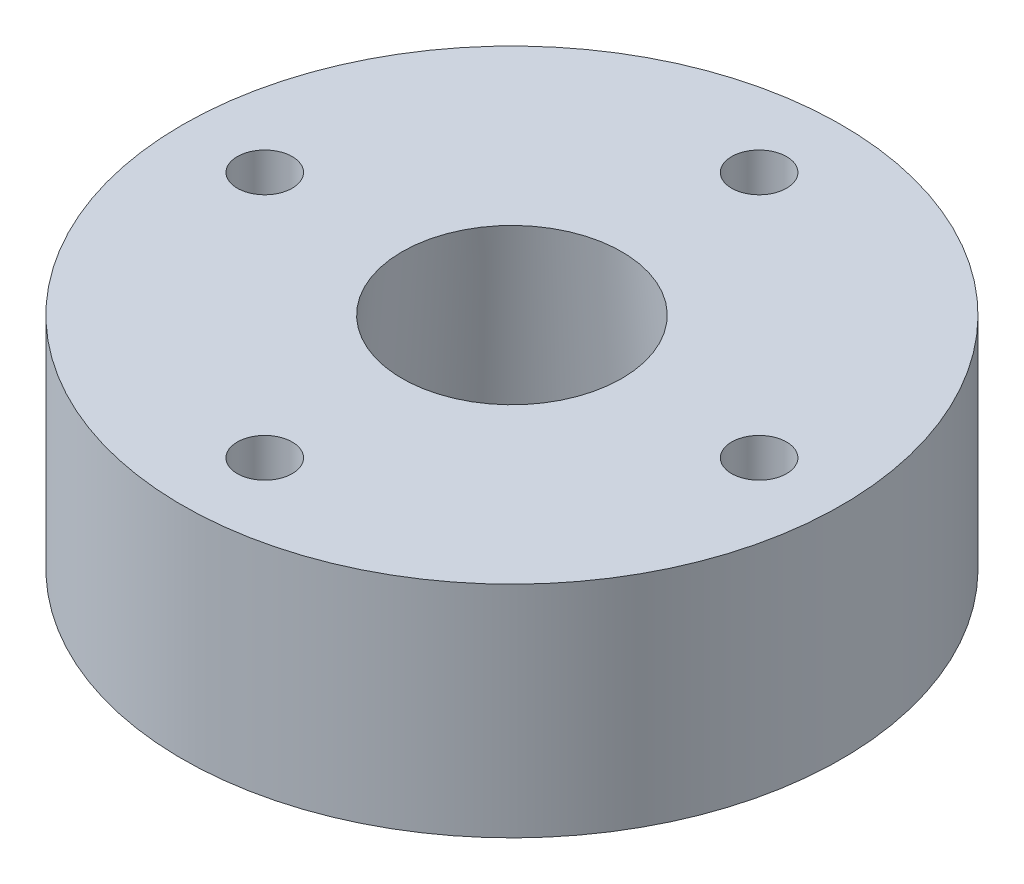
ISO-10303-21;
HEADER;
FILE_DESCRIPTION(('STEP AP214'),'2;1');
FILE_NAME('part.step','',(''),(''),'','','');
FILE_SCHEMA(('AUTOMOTIVE_DESIGN { 1 0 10303 214 1 1 1 1 }'));
ENDSEC;
DATA;
#1=APPLICATION_CONTEXT('core data for automotive mechanical design processes');
#2=APPLICATION_PROTOCOL_DEFINITION('international standard','automotive_design',2000,#1);
#3=PRODUCT_CONTEXT('',#1,'mechanical');
#4=PRODUCT('Part','Part','',(#3));
#5=PRODUCT_RELATED_PRODUCT_CATEGORY('part','',(#4));
#6=PRODUCT_DEFINITION_FORMATION('','',#4);
#7=PRODUCT_DEFINITION_CONTEXT('part definition',#1,'design');
#8=PRODUCT_DEFINITION('design','',#6,#7);
#9=PRODUCT_DEFINITION_SHAPE('','',#8);
#10=(LENGTH_UNIT() NAMED_UNIT(*) SI_UNIT(.MILLI.,.METRE.));
#11=(NAMED_UNIT(*) PLANE_ANGLE_UNIT() SI_UNIT($,.RADIAN.));
#12=(NAMED_UNIT(*) SI_UNIT($,.STERADIAN.) SOLID_ANGLE_UNIT());
#13=UNCERTAINTY_MEASURE_WITH_UNIT(LENGTH_MEASURE(1.E-05),#10,'distance_accuracy_value','');
#14=(GEOMETRIC_REPRESENTATION_CONTEXT(3) GLOBAL_UNCERTAINTY_ASSIGNED_CONTEXT((#13)) GLOBAL_UNIT_ASSIGNED_CONTEXT((#10,
#11,#12)) REPRESENTATION_CONTEXT('',''));
#15=CARTESIAN_POINT('',(0.,0.,0.));
#16=DIRECTION('',(0.,0.,1.));
#17=DIRECTION('',(1.,0.,0.));
#18=AXIS2_PLACEMENT_3D('',#15,#16,#17);
#19=CARTESIAN_POINT('',(-19.05,12.7,0.));
#20=DIRECTION('',(0.,1.,0.));
#21=DIRECTION('',(-1.,0.,0.));
#22=AXIS2_PLACEMENT_3D('',#19,#20,#21);
#23=CYLINDRICAL_SURFACE('',#22,38.1);
#24=CARTESIAN_POINT('',(-19.05,12.7,0.));
#25=DIRECTION('',(0.,1.,0.));
#26=DIRECTION('',(-1.,0.,0.));
#27=AXIS2_PLACEMENT_3D('',#24,#25,#26);
#28=CIRCLE('',#27,38.1);
#29=CARTESIAN_POINT('',(-57.15,12.7,0.));
#30=VERTEX_POINT('',#29);
#31=EDGE_CURVE('E57',#30,#30,#28,.T.);
#32=ORIENTED_EDGE('',*,*,#31,.F.);
#33=EDGE_LOOP('',(#32));
#34=FACE_BOUND('',#33,.T.);
#35=CARTESIAN_POINT('',(-19.05,-12.7,0.));
#36=DIRECTION('',(0.,1.,0.));
#37=DIRECTION('',(-1.,0.,0.));
#38=AXIS2_PLACEMENT_3D('',#35,#36,#37);
#39=CIRCLE('',#38,38.1);
#40=CARTESIAN_POINT('',(-57.15,-12.7,0.));
#41=VERTEX_POINT('',#40);
#42=EDGE_CURVE('E51',#41,#41,#39,.T.);
#43=ORIENTED_EDGE('',*,*,#42,.T.);
#44=EDGE_LOOP('',(#43));
#45=FACE_BOUND('',#44,.T.);
#46=ADVANCED_FACE('F31',(#34,#45),#23,.T.);
#47=CARTESIAN_POINT('',(-2.32040816326527,-12.7,0.));
#48=DIRECTION('',(0.,1.,0.));
#49=DIRECTION('',(-1.,0.,0.));
#50=AXIS2_PLACEMENT_3D('',#47,#48,#49);
#51=PLANE('',#50);
#52=CARTESIAN_POINT('',(-47.6249999999996,-12.7,1.04083408558608E-13));
#53=DIRECTION('',(0.,1.,0.));
#54=DIRECTION('',(-1.,0.,0.));
#55=AXIS2_PLACEMENT_3D('',#52,#53,#54);
#56=CIRCLE('',#55,3.175);
#57=CARTESIAN_POINT('',(-50.7999999999996,-12.7,1.04083408558608E-13));
#58=VERTEX_POINT('',#57);
#59=EDGE_CURVE('E76',#58,#58,#56,.T.);
#60=ORIENTED_EDGE('',*,*,#59,.T.);
#61=EDGE_LOOP('',(#60));
#62=FACE_BOUND('',#61,.T.);
#63=CARTESIAN_POINT('',(-19.0499999999994,-12.7,28.575));
#64=DIRECTION('',(0.,1.,0.));
#65=DIRECTION('',(-1.,0.,0.));
#66=AXIS2_PLACEMENT_3D('',#63,#64,#65);
#67=CIRCLE('',#66,3.175);
#68=CARTESIAN_POINT('',(-22.2249999999994,-12.7,28.575));
#69=VERTEX_POINT('',#68);
#70=EDGE_CURVE('E70',#69,#69,#67,.T.);
#71=ORIENTED_EDGE('',*,*,#70,.T.);
#72=EDGE_LOOP('',(#71));
#73=FACE_BOUND('',#72,.T.);
#74=CARTESIAN_POINT('',(9.5250000000004,-12.7,-3.01841884819964E-13));
#75=DIRECTION('',(0.,1.,0.));
#76=DIRECTION('',(-1.,0.,0.));
#77=AXIS2_PLACEMENT_3D('',#74,#75,#76);
#78=CIRCLE('',#77,3.175);
#79=CARTESIAN_POINT('',(6.35000000000039,-12.7,-3.01841884819964E-13));
#80=VERTEX_POINT('',#79);
#81=EDGE_CURVE('E64',#80,#80,#78,.T.);
#82=ORIENTED_EDGE('',*,*,#81,.T.);
#83=EDGE_LOOP('',(#82));
#84=FACE_BOUND('',#83,.T.);
#85=CARTESIAN_POINT('',(-19.05,-12.7,-28.575));
#86=DIRECTION('',(0.,1.,0.));
#87=DIRECTION('',(-1.,0.,0.));
#88=AXIS2_PLACEMENT_3D('',#85,#86,#87);
#89=CIRCLE('',#88,3.175);
#90=CARTESIAN_POINT('',(-22.225,-12.7,-28.575));
#91=VERTEX_POINT('',#90);
#92=EDGE_CURVE('E60',#91,#91,#89,.T.);
#93=ORIENTED_EDGE('',*,*,#92,.T.);
#94=EDGE_LOOP('',(#93));
#95=FACE_BOUND('',#94,.T.);
#96=CARTESIAN_POINT('',(-19.05,-12.7,0.));
#97=DIRECTION('',(0.,1.,0.));
#98=DIRECTION('',(-1.,0.,0.));
#99=AXIS2_PLACEMENT_3D('',#96,#97,#98);
#100=CIRCLE('',#99,17.5575087097672);
#101=CARTESIAN_POINT('',(-36.6075087097672,-12.7,0.));
#102=VERTEX_POINT('',#101);
#103=EDGE_CURVE('E10',#102,#102,#100,.T.);
#104=ORIENTED_EDGE('',*,*,#103,.T.);
#105=EDGE_LOOP('',(#104));
#106=FACE_BOUND('',#105,.T.);
#107=ORIENTED_EDGE('',*,*,#42,.F.);
#108=EDGE_LOOP('',(#107));
#109=FACE_BOUND('',#108,.T.);
#110=ADVANCED_FACE('F85',(#62,#73,#84,#95,#106,#109),#51,.F.);
#111=CARTESIAN_POINT('',(-19.05,-10.7019158192019,0.));
#112=DIRECTION('',(0.,-1.,0.));
#113=DIRECTION('',(1.,0.,0.));
#114=AXIS2_PLACEMENT_3D('',#111,#112,#113);
#115=CONICAL_SURFACE('',#114,14.7297663008365,0.785833729759229);
#116=CARTESIAN_POINT('',(-19.05,-11.2173707315579,0.));
#117=DIRECTION('',(0.,1.,0.));
#118=DIRECTION('',(-1.,0.,0.));
#119=AXIS2_PLACEMENT_3D('',#116,#117,#118);
#120=CIRCLE('',#119,15.24567043853);
#121=CARTESIAN_POINT('',(-34.29567043853,-11.2173707315579,0.));
#122=VERTEX_POINT('',#121);
#123=EDGE_CURVE('E42',#122,#122,#120,.T.);
#124=ORIENTED_EDGE('',*,*,#123,.T.);
#125=EDGE_LOOP('',(#124));
#126=FACE_BOUND('',#125,.T.);
#127=CARTESIAN_POINT('',(-19.05,-12.1148294120588,0.));
#128=DIRECTION('',(0.,1.,0.));
#129=DIRECTION('',(-1.,0.,0.));
#130=AXIS2_PLACEMENT_3D('',#127,#128,#129);
#131=CIRCLE('',#130,16.1439112653817);
#132=CARTESIAN_POINT('',(-35.1939112653817,-12.1148294120588,0.));
#133=VERTEX_POINT('',#132);
#134=EDGE_CURVE('E46',#133,#133,#131,.F.);
#135=ORIENTED_EDGE('',*,*,#134,.T.);
#136=EDGE_LOOP('',(#135));
#137=FACE_BOUND('',#136,.T.);
#138=ADVANCED_FACE('F117',(#126,#137),#115,.F.);
#139=CARTESIAN_POINT('',(-19.05,12.7,0.));
#140=DIRECTION('',(0.,-1.,0.));
#141=DIRECTION('',(1.,0.,0.));
#142=AXIS2_PLACEMENT_3D('',#139,#140,#141);
#143=CONICAL_SURFACE('',#142,12.7,0.0865185232109481);
#144=CARTESIAN_POINT('',(-19.05,-9.97536256987006,0.));
#145=DIRECTION('',(0.,1.,0.));
#146=DIRECTION('',(-1.,0.,0.));
#147=AXIS2_PLACEMENT_3D('',#144,#145,#146);
#148=CIRCLE('',#147,14.6667486696028);
#149=CARTESIAN_POINT('',(-33.7167486696028,-9.97536256987006,0.));
#150=VERTEX_POINT('',#149);
#151=EDGE_CURVE('E38',#150,#150,#148,.F.);
#152=ORIENTED_EDGE('',*,*,#151,.T.);
#153=EDGE_LOOP('',(#152));
#154=FACE_BOUND('',#153,.T.);
#155=CARTESIAN_POINT('',(-19.05,12.7,0.));
#156=DIRECTION('',(0.,1.,0.));
#157=DIRECTION('',(-1.,0.,0.));
#158=AXIS2_PLACEMENT_3D('',#155,#156,#157);
#159=CIRCLE('',#158,12.7);
#160=CARTESIAN_POINT('',(-31.75,12.7,0.));
#161=VERTEX_POINT('',#160);
#162=EDGE_CURVE('E54',#161,#161,#159,.T.);
#163=ORIENTED_EDGE('',*,*,#162,.T.);
#164=EDGE_LOOP('',(#163));
#165=FACE_BOUND('',#164,.T.);
#166=ADVANCED_FACE('F99',(#154,#165),#143,.F.);
#167=CARTESIAN_POINT('',(-6.35000000000001,12.7,0.));
#168=DIRECTION('',(0.,-1.,0.));
#169=DIRECTION('',(1.,0.,0.));
#170=AXIS2_PLACEMENT_3D('',#167,#168,#169);
#171=PLANE('',#170);
#172=CARTESIAN_POINT('',(-47.6249999999996,12.7,1.04083408558608E-13));
#173=DIRECTION('',(0.,1.,0.));
#174=DIRECTION('',(-1.,0.,0.));
#175=AXIS2_PLACEMENT_3D('',#172,#173,#174);
#176=CIRCLE('',#175,3.175);
#177=CARTESIAN_POINT('',(-50.7999999999996,12.7,1.04083408558608E-13));
#178=VERTEX_POINT('',#177);
#179=EDGE_CURVE('E79',#178,#178,#176,.T.);
#180=ORIENTED_EDGE('',*,*,#179,.F.);
#181=EDGE_LOOP('',(#180));
#182=FACE_BOUND('',#181,.T.);
#183=CARTESIAN_POINT('',(-19.0499999999994,12.7,28.575));
#184=DIRECTION('',(0.,1.,0.));
#185=DIRECTION('',(-1.,0.,0.));
#186=AXIS2_PLACEMENT_3D('',#183,#184,#185);
#187=CIRCLE('',#186,3.175);
#188=CARTESIAN_POINT('',(-22.2249999999994,12.7,28.575));
#189=VERTEX_POINT('',#188);
#190=EDGE_CURVE('E73',#189,#189,#187,.T.);
#191=ORIENTED_EDGE('',*,*,#190,.F.);
#192=EDGE_LOOP('',(#191));
#193=FACE_BOUND('',#192,.T.);
#194=CARTESIAN_POINT('',(9.52500000000039,12.7,-3.01841884819964E-13));
#195=DIRECTION('',(0.,1.,0.));
#196=DIRECTION('',(-1.,0.,0.));
#197=AXIS2_PLACEMENT_3D('',#194,#195,#196);
#198=CIRCLE('',#197,3.175);
#199=CARTESIAN_POINT('',(6.35000000000039,12.7,-3.01841884819964E-13));
#200=VERTEX_POINT('',#199);
#201=EDGE_CURVE('E67',#200,#200,#198,.T.);
#202=ORIENTED_EDGE('',*,*,#201,.F.);
#203=EDGE_LOOP('',(#202));
#204=FACE_BOUND('',#203,.T.);
#205=CARTESIAN_POINT('',(-19.05,12.7,-28.575));
#206=DIRECTION('',(0.,1.,0.));
#207=DIRECTION('',(-1.,0.,0.));
#208=AXIS2_PLACEMENT_3D('',#205,#206,#207);
#209=CIRCLE('',#208,3.175);
#210=CARTESIAN_POINT('',(-22.225,12.7,-28.575));
#211=VERTEX_POINT('',#210);
#212=EDGE_CURVE('E61',#211,#211,#209,.T.);
#213=ORIENTED_EDGE('',*,*,#212,.F.);
#214=EDGE_LOOP('',(#213));
#215=FACE_BOUND('',#214,.T.);
#216=ORIENTED_EDGE('',*,*,#162,.F.);
#217=EDGE_LOOP('',(#216));
#218=FACE_BOUND('',#217,.T.);
#219=ORIENTED_EDGE('',*,*,#31,.T.);
#220=EDGE_LOOP('',(#219));
#221=FACE_BOUND('',#220,.T.);
#222=ADVANCED_FACE('F95',(#182,#193,#204,#215,#218,#221),#171,.F.);
#223=CARTESIAN_POINT('',(-19.05,-9.80254131949903,0.));
#224=DIRECTION('',(0.,-1.,0.));
#225=DIRECTION('',(1.,0.,0.));
#226=AXIS2_PLACEMENT_3D('',#223,#224,#225);
#227=TOROIDAL_SURFACE('',#226,16.6592678829155,2.);
#228=ORIENTED_EDGE('',*,*,#151,.F.);
#229=EDGE_LOOP('',(#228));
#230=FACE_BOUND('',#229,.T.);
#231=ORIENTED_EDGE('',*,*,#123,.F.);
#232=EDGE_LOOP('',(#231));
#233=FACE_BOUND('',#232,.T.);
#234=ADVANCED_FACE('F98',(#230,#233),#227,.T.);
#235=CARTESIAN_POINT('',(-19.05,-10.7,0.));
#236=DIRECTION('',(0.,1.,0.));
#237=DIRECTION('',(-1.,0.,0.));
#238=AXIS2_PLACEMENT_3D('',#235,#236,#237);
#239=TOROIDAL_SURFACE('',#238,17.5575087097672,2.);
#240=ORIENTED_EDGE('',*,*,#134,.F.);
#241=EDGE_LOOP('',(#240));
#242=FACE_BOUND('',#241,.T.);
#243=ORIENTED_EDGE('',*,*,#103,.F.);
#244=EDGE_LOOP('',(#243));
#245=FACE_BOUND('',#244,.T.);
#246=ADVANCED_FACE('F33',(#242,#245),#239,.T.);
#247=CARTESIAN_POINT('',(-19.05,-12.7,-28.575));
#248=DIRECTION('',(0.,1.,0.));
#249=DIRECTION('',(-1.,0.,0.));
#250=AXIS2_PLACEMENT_3D('',#247,#248,#249);
#251=CYLINDRICAL_SURFACE('',#250,3.175);
#252=ORIENTED_EDGE('',*,*,#92,.F.);
#253=EDGE_LOOP('',(#252));
#254=FACE_BOUND('',#253,.T.);
#255=ORIENTED_EDGE('',*,*,#212,.T.);
#256=EDGE_LOOP('',(#255));
#257=FACE_BOUND('',#256,.T.);
#258=ADVANCED_FACE('F130',(#254,#257),#251,.F.);
#259=CARTESIAN_POINT('',(9.5250000000004,-12.7,-3.01841884819964E-13));
#260=DIRECTION('',(0.,1.,0.));
#261=DIRECTION('',(-1.,0.,0.));
#262=AXIS2_PLACEMENT_3D('',#259,#260,#261);
#263=CYLINDRICAL_SURFACE('',#262,3.175);
#264=ORIENTED_EDGE('',*,*,#81,.F.);
#265=EDGE_LOOP('',(#264));
#266=FACE_BOUND('',#265,.T.);
#267=ORIENTED_EDGE('',*,*,#201,.T.);
#268=EDGE_LOOP('',(#267));
#269=FACE_BOUND('',#268,.T.);
#270=ADVANCED_FACE('F140',(#266,#269),#263,.F.);
#271=CARTESIAN_POINT('',(-19.0499999999994,-12.7,28.575));
#272=DIRECTION('',(0.,1.,0.));
#273=DIRECTION('',(-1.,0.,0.));
#274=AXIS2_PLACEMENT_3D('',#271,#272,#273);
#275=CYLINDRICAL_SURFACE('',#274,3.175);
#276=ORIENTED_EDGE('',*,*,#70,.F.);
#277=EDGE_LOOP('',(#276));
#278=FACE_BOUND('',#277,.T.);
#279=ORIENTED_EDGE('',*,*,#190,.T.);
#280=EDGE_LOOP('',(#279));
#281=FACE_BOUND('',#280,.T.);
#282=ADVANCED_FACE('F91',(#278,#281),#275,.F.);
#283=CARTESIAN_POINT('',(-47.6249999999996,-12.7,1.04083408558608E-13));
#284=DIRECTION('',(0.,1.,0.));
#285=DIRECTION('',(-1.,0.,0.));
#286=AXIS2_PLACEMENT_3D('',#283,#284,#285);
#287=CYLINDRICAL_SURFACE('',#286,3.175);
#288=ORIENTED_EDGE('',*,*,#59,.F.);
#289=EDGE_LOOP('',(#288));
#290=FACE_BOUND('',#289,.T.);
#291=ORIENTED_EDGE('',*,*,#179,.T.);
#292=EDGE_LOOP('',(#291));
#293=FACE_BOUND('',#292,.T.);
#294=ADVANCED_FACE('F88',(#290,#293),#287,.F.);
#295=CLOSED_SHELL('',(#46,#110,#138,#166,#222,#234,#246,#258,#270,#282,#294));
#296=MANIFOLD_SOLID_BREP('B2',#295);
#297=ADVANCED_BREP_SHAPE_REPRESENTATION('',(#18,#296),#14);
#298=SHAPE_DEFINITION_REPRESENTATION(#9,#297);
ENDSEC;
END-ISO-10303-21;
